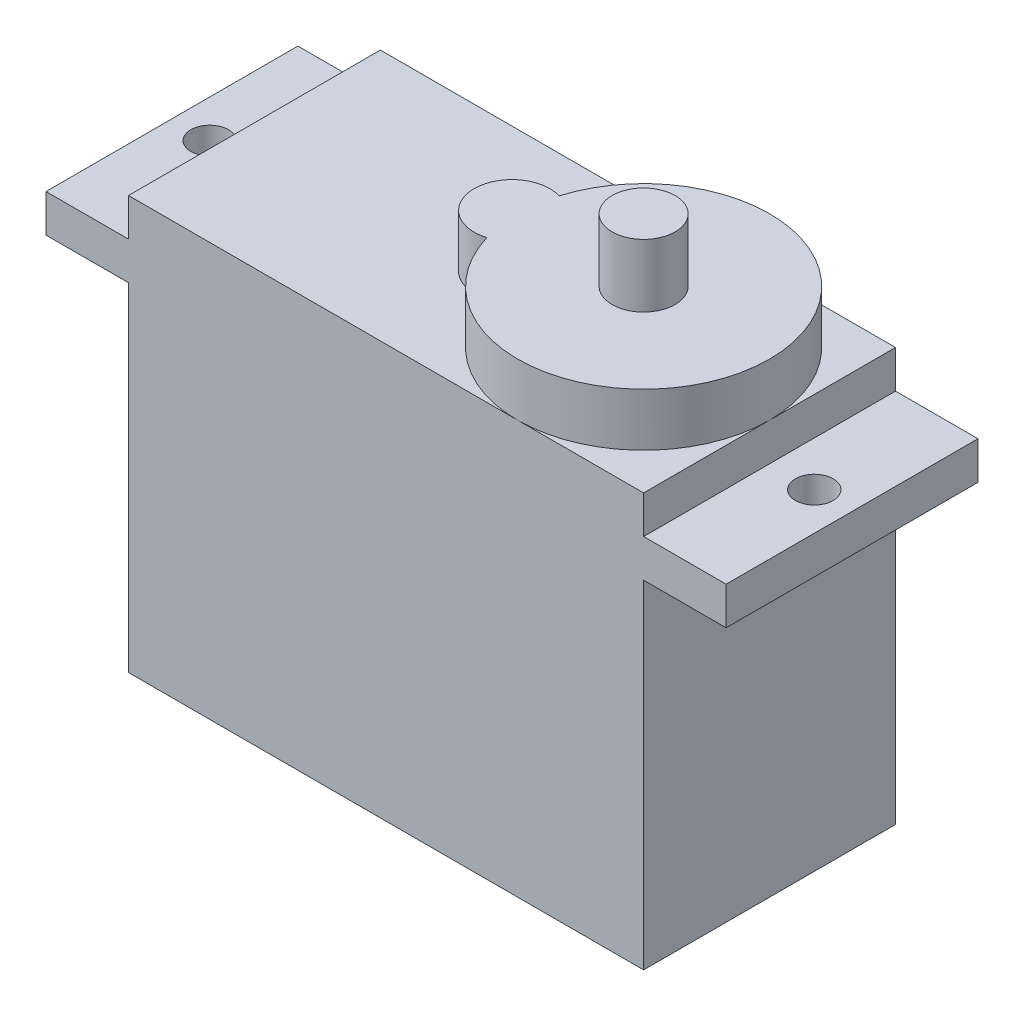
ISO-10303-21;
HEADER;
FILE_DESCRIPTION(('STEP AP214'),'2;1');
FILE_NAME('part.step','',(''),(''),'','','');
FILE_SCHEMA(('AUTOMOTIVE_DESIGN { 1 0 10303 214 1 1 1 1 }'));
ENDSEC;
DATA;
#1=APPLICATION_CONTEXT('core data for automotive mechanical design processes');
#2=APPLICATION_PROTOCOL_DEFINITION('international standard','automotive_design',2000,#1);
#3=PRODUCT_CONTEXT('',#1,'mechanical');
#4=PRODUCT('Part','Part','',(#3));
#5=PRODUCT_RELATED_PRODUCT_CATEGORY('part','',(#4));
#6=PRODUCT_DEFINITION_FORMATION('','',#4);
#7=PRODUCT_DEFINITION_CONTEXT('part definition',#1,'design');
#8=PRODUCT_DEFINITION('design','',#6,#7);
#9=PRODUCT_DEFINITION_SHAPE('','',#8);
#10=(LENGTH_UNIT() NAMED_UNIT(*) SI_UNIT(.MILLI.,.METRE.));
#11=(NAMED_UNIT(*) PLANE_ANGLE_UNIT() SI_UNIT($,.RADIAN.));
#12=(NAMED_UNIT(*) SI_UNIT($,.STERADIAN.) SOLID_ANGLE_UNIT());
#13=UNCERTAINTY_MEASURE_WITH_UNIT(LENGTH_MEASURE(1.E-05),#10,'distance_accuracy_value','');
#14=(GEOMETRIC_REPRESENTATION_CONTEXT(3) GLOBAL_UNCERTAINTY_ASSIGNED_CONTEXT((#13)) GLOBAL_UNIT_ASSIGNED_CONTEXT((#10,
#11,#12)) REPRESENTATION_CONTEXT('',''));
#15=CARTESIAN_POINT('',(0.,0.,0.));
#16=DIRECTION('',(0.,0.,1.));
#17=DIRECTION('',(1.,0.,0.));
#18=AXIS2_PLACEMENT_3D('',#15,#16,#17);
#19=CARTESIAN_POINT('',(0.,19.4,0.));
#20=DIRECTION('',(0.,1.,0.));
#21=DIRECTION('',(0.,0.,1.));
#22=AXIS2_PLACEMENT_3D('',#19,#20,#21);
#23=PLANE('',#22);
#24=CARTESIAN_POINT('',(0.,19.4,0.));
#25=DIRECTION('',(0.,1.,0.));
#26=DIRECTION('',(0.,0.,1.));
#27=AXIS2_PLACEMENT_3D('',#24,#25,#26);
#28=CIRCLE('',#27,3.);
#29=CARTESIAN_POINT('',(0.870933014354067,19.4,-2.87079704690319));
#30=VERTEX_POINT('',#29);
#31=CARTESIAN_POINT('',(0.870933014354069,19.4,2.87079704690319));
#32=VERTEX_POINT('',#31);
#33=EDGE_CURVE('E166',#30,#32,#28,.T.);
#34=ORIENTED_EDGE('',*,*,#33,.F.);
#35=CARTESIAN_POINT('',(10.45,19.4,0.));
#36=DIRECTION('',(0.,1.,0.));
#37=DIRECTION('',(0.,0.,1.));
#38=AXIS2_PLACEMENT_3D('',#35,#36,#37);
#39=CIRCLE('',#38,10.);
#40=CARTESIAN_POINT('',(10.45,19.4,-10.));
#41=VERTEX_POINT('',#40);
#42=EDGE_CURVE('E270',#41,#30,#39,.T.);
#43=ORIENTED_EDGE('',*,*,#42,.F.);
#44=DIRECTION('',(-1.,0.,0.));
#45=VECTOR('',#44,1.);
#46=CARTESIAN_POINT('',(-20.45,19.4,-10.));
#47=LINE('',#46,#45);
#48=CARTESIAN_POINT('',(-20.45,19.4,-10.));
#49=VERTEX_POINT('',#48);
#50=EDGE_CURVE('E176',#41,#49,#47,.T.);
#51=ORIENTED_EDGE('',*,*,#50,.T.);
#52=DIRECTION('',(0.,0.,1.));
#53=VECTOR('',#52,1.);
#54=CARTESIAN_POINT('',(-20.45,19.4,-10.));
#55=LINE('',#54,#53);
#56=CARTESIAN_POINT('',(-20.45,19.4,10.));
#57=VERTEX_POINT('',#56);
#58=EDGE_CURVE('E181',#49,#57,#55,.T.);
#59=ORIENTED_EDGE('',*,*,#58,.T.);
#60=DIRECTION('',(1.,0.,0.));
#61=VECTOR('',#60,1.);
#62=CARTESIAN_POINT('',(-20.45,19.4,10.));
#63=LINE('',#62,#61);
#64=CARTESIAN_POINT('',(10.45,19.4,10.));
#65=VERTEX_POINT('',#64);
#66=EDGE_CURVE('E184',#57,#65,#63,.T.);
#67=ORIENTED_EDGE('',*,*,#66,.T.);
#68=EDGE_CURVE('E49',#32,#65,#39,.T.);
#69=ORIENTED_EDGE('',*,*,#68,.F.);
#70=EDGE_LOOP('',(#34,#43,#51,#59,#67,#69));
#71=FACE_BOUND('',#70,.T.);
#72=ADVANCED_FACE('F38',(#71),#23,.T.);
#73=CARTESIAN_POINT('',(20.45,19.4,0.));
#74=VERTEX_POINT('',#73);
#75=EDGE_CURVE('E11',#65,#74,#39,.T.);
#76=ORIENTED_EDGE('',*,*,#75,.F.);
#77=CARTESIAN_POINT('',(20.45,19.4,10.));
#78=VERTEX_POINT('',#77);
#79=EDGE_CURVE('E183',#65,#78,#63,.T.);
#80=ORIENTED_EDGE('',*,*,#79,.T.);
#81=DIRECTION('',(0.,0.,-1.));
#82=VECTOR('',#81,1.);
#83=CARTESIAN_POINT('',(20.45,19.4,-10.));
#84=LINE('',#83,#82);
#85=EDGE_CURVE('E174',#78,#74,#84,.T.);
#86=ORIENTED_EDGE('',*,*,#85,.T.);
#87=EDGE_LOOP('',(#76,#80,#86));
#88=FACE_BOUND('',#87,.T.);
#89=ADVANCED_FACE('F297',(#88),#23,.T.);
#90=CARTESIAN_POINT('',(0.,16.4,0.));
#91=DIRECTION('',(0.,1.,0.));
#92=DIRECTION('',(-1.,0.,0.));
#93=AXIS2_PLACEMENT_3D('',#90,#91,#92);
#94=PLANE('',#93);
#95=DIRECTION('',(0.,0.,-1.));
#96=VECTOR('',#95,1.);
#97=CARTESIAN_POINT('',(20.45,16.4,-10.));
#98=LINE('',#97,#96);
#99=CARTESIAN_POINT('',(20.45,16.4,10.));
#100=VERTEX_POINT('',#99);
#101=CARTESIAN_POINT('',(20.45,16.4,-10.));
#102=VERTEX_POINT('',#101);
#103=EDGE_CURVE('E167',#100,#102,#98,.T.);
#104=ORIENTED_EDGE('',*,*,#103,.F.);
#105=DIRECTION('',(1.,0.,0.));
#106=VECTOR('',#105,1.);
#107=CARTESIAN_POINT('',(-27.,16.4,10.));
#108=LINE('',#107,#106);
#109=CARTESIAN_POINT('',(27.,16.4,10.));
#110=VERTEX_POINT('',#109);
#111=EDGE_CURVE('E222',#100,#110,#108,.T.);
#112=ORIENTED_EDGE('',*,*,#111,.T.);
#113=DIRECTION('',(0.,0.,-1.));
#114=VECTOR('',#113,1.);
#115=CARTESIAN_POINT('',(27.,16.4,-10.));
#116=LINE('',#115,#114);
#117=CARTESIAN_POINT('',(27.,16.4,-10.));
#118=VERTEX_POINT('',#117);
#119=EDGE_CURVE('E213',#110,#118,#116,.T.);
#120=ORIENTED_EDGE('',*,*,#119,.T.);
#121=DIRECTION('',(-1.,0.,0.));
#122=VECTOR('',#121,1.);
#123=CARTESIAN_POINT('',(-27.,16.4,-10.));
#124=LINE('',#123,#122);
#125=EDGE_CURVE('E218',#118,#102,#124,.T.);
#126=ORIENTED_EDGE('',*,*,#125,.T.);
#127=EDGE_LOOP('',(#104,#112,#120,#126));
#128=FACE_BOUND('',#127,.T.);
#129=CARTESIAN_POINT('',(24.,16.4,0.));
#130=DIRECTION('',(0.,1.,0.));
#131=DIRECTION('',(-1.,0.,0.));
#132=AXIS2_PLACEMENT_3D('',#129,#130,#131);
#133=CIRCLE('',#132,1.5);
#134=CARTESIAN_POINT('',(22.5,16.4,0.));
#135=VERTEX_POINT('',#134);
#136=EDGE_CURVE('E200',#135,#135,#133,.T.);
#137=ORIENTED_EDGE('',*,*,#136,.F.);
#138=EDGE_LOOP('',(#137));
#139=FACE_BOUND('',#138,.T.);
#140=ADVANCED_FACE('F303',(#128,#139),#94,.T.);
#141=CARTESIAN_POINT('',(20.45,13.4,10.));
#142=DIRECTION('',(-1.,0.,0.));
#143=DIRECTION('',(0.,-1.,0.));
#144=AXIS2_PLACEMENT_3D('',#141,#142,#143);
#145=PLANE('',#144);
#146=DIRECTION('',(0.,1.,0.));
#147=VECTOR('',#146,1.);
#148=CARTESIAN_POINT('',(20.45,13.4,-10.));
#149=LINE('',#148,#147);
#150=CARTESIAN_POINT('',(20.45,-13.4,-10.));
#151=VERTEX_POINT('',#150);
#152=CARTESIAN_POINT('',(20.45,13.4,-10.));
#153=VERTEX_POINT('',#152);
#154=EDGE_CURVE('E248',#151,#153,#149,.T.);
#155=ORIENTED_EDGE('',*,*,#154,.T.);
#156=DIRECTION('',(0.,0.,-1.));
#157=VECTOR('',#156,1.);
#158=CARTESIAN_POINT('',(20.45,13.4,10.));
#159=LINE('',#158,#157);
#160=CARTESIAN_POINT('',(20.45,13.4,10.));
#161=VERTEX_POINT('',#160);
#162=EDGE_CURVE('E42',#161,#153,#159,.T.);
#163=ORIENTED_EDGE('',*,*,#162,.F.);
#164=DIRECTION('',(0.,1.,0.));
#165=VECTOR('',#164,1.);
#166=CARTESIAN_POINT('',(20.45,13.4,10.));
#167=LINE('',#166,#165);
#168=CARTESIAN_POINT('',(20.45,-13.4,10.));
#169=VERTEX_POINT('',#168);
#170=EDGE_CURVE('E249',#169,#161,#167,.T.);
#171=ORIENTED_EDGE('',*,*,#170,.F.);
#172=DIRECTION('',(0.,0.,-1.));
#173=VECTOR('',#172,1.);
#174=CARTESIAN_POINT('',(20.45,-13.4,10.));
#175=LINE('',#174,#173);
#176=EDGE_CURVE('E256',#169,#151,#175,.T.);
#177=ORIENTED_EDGE('',*,*,#176,.T.);
#178=EDGE_LOOP('',(#155,#163,#171,#177));
#179=FACE_BOUND('',#178,.T.);
#180=ADVANCED_FACE('F40',(#179),#145,.F.);
#181=CARTESIAN_POINT('',(-20.45,13.4,10.));
#182=DIRECTION('',(1.,0.,0.));
#183=DIRECTION('',(0.,1.,0.));
#184=AXIS2_PLACEMENT_3D('',#181,#182,#183);
#185=PLANE('',#184);
#186=DIRECTION('',(0.,-1.,0.));
#187=VECTOR('',#186,1.);
#188=CARTESIAN_POINT('',(-20.45,13.4,-10.));
#189=LINE('',#188,#187);
#190=CARTESIAN_POINT('',(-20.45,13.4,-10.));
#191=VERTEX_POINT('',#190);
#192=CARTESIAN_POINT('',(-20.45,-13.4,-10.));
#193=VERTEX_POINT('',#192);
#194=EDGE_CURVE('E258',#191,#193,#189,.T.);
#195=ORIENTED_EDGE('',*,*,#194,.T.);
#196=DIRECTION('',(0.,0.,-1.));
#197=VECTOR('',#196,1.);
#198=CARTESIAN_POINT('',(-20.45,-13.4,10.));
#199=LINE('',#198,#197);
#200=CARTESIAN_POINT('',(-20.45,-13.4,10.));
#201=VERTEX_POINT('',#200);
#202=EDGE_CURVE('E263',#201,#193,#199,.T.);
#203=ORIENTED_EDGE('',*,*,#202,.F.);
#204=DIRECTION('',(0.,-1.,0.));
#205=VECTOR('',#204,1.);
#206=CARTESIAN_POINT('',(-20.45,13.4,10.));
#207=LINE('',#206,#205);
#208=CARTESIAN_POINT('',(-20.45,13.4,10.));
#209=VERTEX_POINT('',#208);
#210=EDGE_CURVE('E251',#209,#201,#207,.T.);
#211=ORIENTED_EDGE('',*,*,#210,.F.);
#212=DIRECTION('',(0.,0.,-1.));
#213=VECTOR('',#212,1.);
#214=CARTESIAN_POINT('',(-20.45,13.4,10.));
#215=LINE('',#214,#213);
#216=EDGE_CURVE('E265',#209,#191,#215,.T.);
#217=ORIENTED_EDGE('',*,*,#216,.T.);
#218=EDGE_LOOP('',(#195,#203,#211,#217));
#219=FACE_BOUND('',#218,.T.);
#220=ADVANCED_FACE('F355',(#219),#185,.F.);
#221=CARTESIAN_POINT('',(-20.45,-13.4,10.));
#222=DIRECTION('',(0.,1.,0.));
#223=DIRECTION('',(0.,0.,1.));
#224=AXIS2_PLACEMENT_3D('',#221,#222,#223);
#225=PLANE('',#224);
#226=DIRECTION('',(1.,0.,0.));
#227=VECTOR('',#226,1.);
#228=CARTESIAN_POINT('',(-20.45,-13.4,-10.));
#229=LINE('',#228,#227);
#230=EDGE_CURVE('E252',#193,#151,#229,.T.);
#231=ORIENTED_EDGE('',*,*,#230,.T.);
#232=ORIENTED_EDGE('',*,*,#176,.F.);
#233=DIRECTION('',(1.,0.,0.));
#234=VECTOR('',#233,1.);
#235=CARTESIAN_POINT('',(-20.45,-13.4,10.));
#236=LINE('',#235,#234);
#237=EDGE_CURVE('E254',#201,#169,#236,.T.);
#238=ORIENTED_EDGE('',*,*,#237,.F.);
#239=ORIENTED_EDGE('',*,*,#202,.T.);
#240=EDGE_LOOP('',(#231,#232,#238,#239));
#241=FACE_BOUND('',#240,.T.);
#242=ADVANCED_FACE('F358',(#241),#225,.F.);
#243=CARTESIAN_POINT('',(0.,0.,10.));
#244=DIRECTION('',(0.,0.,1.));
#245=DIRECTION('',(1.,0.,0.));
#246=AXIS2_PLACEMENT_3D('',#243,#244,#245);
#247=PLANE('',#246);
#248=ORIENTED_EDGE('',*,*,#170,.T.);
#249=DIRECTION('',(1.,0.,0.));
#250=VECTOR('',#249,1.);
#251=CARTESIAN_POINT('',(-27.,13.4,10.));
#252=LINE('',#251,#250);
#253=CARTESIAN_POINT('',(27.,13.4,10.));
#254=VERTEX_POINT('',#253);
#255=EDGE_CURVE('E234',#161,#254,#252,.T.);
#256=ORIENTED_EDGE('',*,*,#255,.T.);
#257=DIRECTION('',(0.,-1.,0.));
#258=VECTOR('',#257,1.);
#259=CARTESIAN_POINT('',(27.,16.4,10.));
#260=LINE('',#259,#258);
#261=EDGE_CURVE('E225',#110,#254,#260,.T.);
#262=ORIENTED_EDGE('',*,*,#261,.F.);
#263=ORIENTED_EDGE('',*,*,#111,.F.);
#264=DIRECTION('',(0.,-1.,0.));
#265=VECTOR('',#264,1.);
#266=CARTESIAN_POINT('',(20.45,19.4,10.));
#267=LINE('',#266,#265);
#268=EDGE_CURVE('E185',#78,#100,#267,.T.);
#269=ORIENTED_EDGE('',*,*,#268,.F.);
#270=ORIENTED_EDGE('',*,*,#79,.F.);
#271=ORIENTED_EDGE('',*,*,#66,.F.);
#272=DIRECTION('',(0.,-1.,0.));
#273=VECTOR('',#272,1.);
#274=CARTESIAN_POINT('',(-20.45,19.4,10.));
#275=LINE('',#274,#273);
#276=CARTESIAN_POINT('',(-20.45,16.4,10.));
#277=VERTEX_POINT('',#276);
#278=EDGE_CURVE('E191',#57,#277,#275,.T.);
#279=ORIENTED_EDGE('',*,*,#278,.T.);
#280=CARTESIAN_POINT('',(-27.,16.4,10.));
#281=VERTEX_POINT('',#280);
#282=EDGE_CURVE('E223',#281,#277,#108,.T.);
#283=ORIENTED_EDGE('',*,*,#282,.F.);
#284=DIRECTION('',(0.,-1.,0.));
#285=VECTOR('',#284,1.);
#286=CARTESIAN_POINT('',(-27.,16.4,10.));
#287=LINE('',#286,#285);
#288=CARTESIAN_POINT('',(-27.,13.4,10.));
#289=VERTEX_POINT('',#288);
#290=EDGE_CURVE('E239',#281,#289,#287,.T.);
#291=ORIENTED_EDGE('',*,*,#290,.T.);
#292=EDGE_CURVE('E217',#289,#209,#252,.T.);
#293=ORIENTED_EDGE('',*,*,#292,.T.);
#294=ORIENTED_EDGE('',*,*,#210,.T.);
#295=ORIENTED_EDGE('',*,*,#237,.T.);
#296=EDGE_LOOP('',(#248,#256,#262,#263,#269,#270,#271,#279,#283,#291,#293,#294,#295));
#297=FACE_BOUND('',#296,.T.);
#298=ADVANCED_FACE('F324',(#297),#247,.T.);
#299=CARTESIAN_POINT('',(0.,0.,-10.));
#300=DIRECTION('',(0.,0.,1.));
#301=DIRECTION('',(1.,0.,0.));
#302=AXIS2_PLACEMENT_3D('',#299,#300,#301);
#303=PLANE('',#302);
#304=ORIENTED_EDGE('',*,*,#154,.F.);
#305=ORIENTED_EDGE('',*,*,#230,.F.);
#306=ORIENTED_EDGE('',*,*,#194,.F.);
#307=DIRECTION('',(-1.,0.,0.));
#308=VECTOR('',#307,1.);
#309=CARTESIAN_POINT('',(-27.,13.4,-10.));
#310=LINE('',#309,#308);
#311=CARTESIAN_POINT('',(-27.,13.4,-10.));
#312=VERTEX_POINT('',#311);
#313=EDGE_CURVE('E228',#191,#312,#310,.T.);
#314=ORIENTED_EDGE('',*,*,#313,.T.);
#315=DIRECTION('',(0.,-1.,0.));
#316=VECTOR('',#315,1.);
#317=CARTESIAN_POINT('',(-27.,16.4,-10.));
#318=LINE('',#317,#316);
#319=CARTESIAN_POINT('',(-27.,16.4,-10.));
#320=VERTEX_POINT('',#319);
#321=EDGE_CURVE('E242',#320,#312,#318,.T.);
#322=ORIENTED_EDGE('',*,*,#321,.F.);
#323=CARTESIAN_POINT('',(-20.45,16.4,-10.));
#324=VERTEX_POINT('',#323);
#325=EDGE_CURVE('E216',#324,#320,#124,.T.);
#326=ORIENTED_EDGE('',*,*,#325,.F.);
#327=DIRECTION('',(0.,-1.,0.));
#328=VECTOR('',#327,1.);
#329=CARTESIAN_POINT('',(-20.45,19.4,-10.));
#330=LINE('',#329,#328);
#331=EDGE_CURVE('E194',#49,#324,#330,.T.);
#332=ORIENTED_EDGE('',*,*,#331,.F.);
#333=ORIENTED_EDGE('',*,*,#50,.F.);
#334=CARTESIAN_POINT('',(20.45,19.4,-10.));
#335=VERTEX_POINT('',#334);
#336=EDGE_CURVE('E178',#335,#41,#47,.T.);
#337=ORIENTED_EDGE('',*,*,#336,.F.);
#338=DIRECTION('',(0.,-1.,0.));
#339=VECTOR('',#338,1.);
#340=CARTESIAN_POINT('',(20.45,19.4,-10.));
#341=LINE('',#340,#339);
#342=EDGE_CURVE('E197',#335,#102,#341,.T.);
#343=ORIENTED_EDGE('',*,*,#342,.T.);
#344=ORIENTED_EDGE('',*,*,#125,.F.);
#345=DIRECTION('',(0.,-1.,0.));
#346=VECTOR('',#345,1.);
#347=CARTESIAN_POINT('',(27.,16.4,-10.));
#348=LINE('',#347,#346);
#349=CARTESIAN_POINT('',(27.,13.4,-10.));
#350=VERTEX_POINT('',#349);
#351=EDGE_CURVE('E245',#118,#350,#348,.T.);
#352=ORIENTED_EDGE('',*,*,#351,.T.);
#353=EDGE_CURVE('E229',#350,#153,#310,.T.);
#354=ORIENTED_EDGE('',*,*,#353,.T.);
#355=EDGE_LOOP('',(#304,#305,#306,#314,#322,#326,#332,#333,#337,#343,#344,#352,#354));
#356=FACE_BOUND('',#355,.T.);
#357=ADVANCED_FACE('F332',(#356),#303,.F.);
#358=CARTESIAN_POINT('',(0.,13.4,0.));
#359=DIRECTION('',(0.,1.,0.));
#360=DIRECTION('',(-1.,0.,0.));
#361=AXIS2_PLACEMENT_3D('',#358,#359,#360);
#362=PLANE('',#361);
#363=CARTESIAN_POINT('',(24.,13.4,0.));
#364=DIRECTION('',(0.,1.,0.));
#365=DIRECTION('',(-1.,0.,0.));
#366=AXIS2_PLACEMENT_3D('',#363,#364,#365);
#367=CIRCLE('',#366,1.5);
#368=CARTESIAN_POINT('',(22.5,13.4,0.));
#369=VERTEX_POINT('',#368);
#370=EDGE_CURVE('E208',#369,#369,#367,.T.);
#371=ORIENTED_EDGE('',*,*,#370,.T.);
#372=EDGE_LOOP('',(#371));
#373=FACE_BOUND('',#372,.T.);
#374=ORIENTED_EDGE('',*,*,#255,.F.);
#375=ORIENTED_EDGE('',*,*,#162,.T.);
#376=ORIENTED_EDGE('',*,*,#353,.F.);
#377=DIRECTION('',(0.,0.,-1.));
#378=VECTOR('',#377,1.);
#379=CARTESIAN_POINT('',(27.,13.4,-10.));
#380=LINE('',#379,#378);
#381=EDGE_CURVE('E204',#254,#350,#380,.T.);
#382=ORIENTED_EDGE('',*,*,#381,.F.);
#383=EDGE_LOOP('',(#374,#375,#376,#382));
#384=FACE_BOUND('',#383,.T.);
#385=ADVANCED_FACE('F364',(#373,#384),#362,.F.);
#386=CARTESIAN_POINT('',(27.,16.4,-10.));
#387=DIRECTION('',(-1.,0.,0.));
#388=DIRECTION('',(0.,-1.,0.));
#389=AXIS2_PLACEMENT_3D('',#386,#387,#388);
#390=PLANE('',#389);
#391=ORIENTED_EDGE('',*,*,#381,.T.);
#392=ORIENTED_EDGE('',*,*,#351,.F.);
#393=ORIENTED_EDGE('',*,*,#119,.F.);
#394=ORIENTED_EDGE('',*,*,#261,.T.);
#395=EDGE_LOOP('',(#391,#392,#393,#394));
#396=FACE_BOUND('',#395,.T.);
#397=ADVANCED_FACE('F363',(#396),#390,.F.);
#398=CARTESIAN_POINT('',(-27.,16.4,-10.));
#399=DIRECTION('',(1.,0.,0.));
#400=DIRECTION('',(0.,1.,0.));
#401=AXIS2_PLACEMENT_3D('',#398,#399,#400);
#402=PLANE('',#401);
#403=DIRECTION('',(0.,0.,1.));
#404=VECTOR('',#403,1.);
#405=CARTESIAN_POINT('',(-27.,13.4,-10.));
#406=LINE('',#405,#404);
#407=EDGE_CURVE('E232',#312,#289,#406,.T.);
#408=ORIENTED_EDGE('',*,*,#407,.T.);
#409=ORIENTED_EDGE('',*,*,#290,.F.);
#410=DIRECTION('',(0.,0.,1.));
#411=VECTOR('',#410,1.);
#412=CARTESIAN_POINT('',(-27.,16.4,-10.));
#413=LINE('',#412,#411);
#414=EDGE_CURVE('E220',#320,#281,#413,.T.);
#415=ORIENTED_EDGE('',*,*,#414,.F.);
#416=ORIENTED_EDGE('',*,*,#321,.T.);
#417=EDGE_LOOP('',(#408,#409,#415,#416));
#418=FACE_BOUND('',#417,.T.);
#419=ADVANCED_FACE('F347',(#418),#402,.F.);
#420=DIRECTION('',(0.,0.,1.));
#421=VECTOR('',#420,1.);
#422=CARTESIAN_POINT('',(-20.45,16.4,-10.));
#423=LINE('',#422,#421);
#424=EDGE_CURVE('E170',#324,#277,#423,.T.);
#425=ORIENTED_EDGE('',*,*,#424,.F.);
#426=ORIENTED_EDGE('',*,*,#325,.T.);
#427=ORIENTED_EDGE('',*,*,#414,.T.);
#428=ORIENTED_EDGE('',*,*,#282,.T.);
#429=EDGE_LOOP('',(#425,#426,#427,#428));
#430=FACE_BOUND('',#429,.T.);
#431=CARTESIAN_POINT('',(-24.,16.4,0.));
#432=DIRECTION('',(0.,1.,0.));
#433=DIRECTION('',(-1.,0.,0.));
#434=AXIS2_PLACEMENT_3D('',#431,#432,#433);
#435=CIRCLE('',#434,1.5);
#436=CARTESIAN_POINT('',(-25.5,16.4,0.));
#437=VERTEX_POINT('',#436);
#438=EDGE_CURVE('E205',#437,#437,#435,.T.);
#439=ORIENTED_EDGE('',*,*,#438,.F.);
#440=EDGE_LOOP('',(#439));
#441=FACE_BOUND('',#440,.T.);
#442=ADVANCED_FACE('F342',(#430,#441),#94,.T.);
#443=CARTESIAN_POINT('',(-24.,13.4,0.));
#444=DIRECTION('',(0.,1.,0.));
#445=DIRECTION('',(-1.,0.,0.));
#446=AXIS2_PLACEMENT_3D('',#443,#444,#445);
#447=CIRCLE('',#446,1.5);
#448=CARTESIAN_POINT('',(-25.5,13.4,0.));
#449=VERTEX_POINT('',#448);
#450=EDGE_CURVE('E201',#449,#449,#447,.T.);
#451=ORIENTED_EDGE('',*,*,#450,.T.);
#452=EDGE_LOOP('',(#451));
#453=FACE_BOUND('',#452,.T.);
#454=ORIENTED_EDGE('',*,*,#216,.F.);
#455=ORIENTED_EDGE('',*,*,#292,.F.);
#456=ORIENTED_EDGE('',*,*,#407,.F.);
#457=ORIENTED_EDGE('',*,*,#313,.F.);
#458=EDGE_LOOP('',(#454,#455,#456,#457));
#459=FACE_BOUND('',#458,.T.);
#460=ADVANCED_FACE('F351',(#453,#459),#362,.F.);
#461=CARTESIAN_POINT('',(-24.,13.4,0.));
#462=DIRECTION('',(0.,1.,0.));
#463=DIRECTION('',(-1.,0.,0.));
#464=AXIS2_PLACEMENT_3D('',#461,#462,#463);
#465=CYLINDRICAL_SURFACE('',#464,1.5);
#466=ORIENTED_EDGE('',*,*,#450,.F.);
#467=EDGE_LOOP('',(#466));
#468=FACE_BOUND('',#467,.T.);
#469=ORIENTED_EDGE('',*,*,#438,.T.);
#470=EDGE_LOOP('',(#469));
#471=FACE_BOUND('',#470,.T.);
#472=ADVANCED_FACE('F377',(#468,#471),#465,.F.);
#473=CARTESIAN_POINT('',(24.,13.4,0.));
#474=DIRECTION('',(0.,1.,0.));
#475=DIRECTION('',(-1.,0.,0.));
#476=AXIS2_PLACEMENT_3D('',#473,#474,#475);
#477=CYLINDRICAL_SURFACE('',#476,1.5);
#478=ORIENTED_EDGE('',*,*,#370,.F.);
#479=EDGE_LOOP('',(#478));
#480=FACE_BOUND('',#479,.T.);
#481=ORIENTED_EDGE('',*,*,#136,.T.);
#482=EDGE_LOOP('',(#481));
#483=FACE_BOUND('',#482,.T.);
#484=ADVANCED_FACE('F383',(#480,#483),#477,.F.);
#485=CARTESIAN_POINT('',(20.45,19.4,-10.));
#486=DIRECTION('',(-1.,0.,0.));
#487=DIRECTION('',(0.,-1.,0.));
#488=AXIS2_PLACEMENT_3D('',#485,#486,#487);
#489=PLANE('',#488);
#490=ORIENTED_EDGE('',*,*,#103,.T.);
#491=ORIENTED_EDGE('',*,*,#342,.F.);
#492=EDGE_CURVE('E177',#74,#335,#84,.T.);
#493=ORIENTED_EDGE('',*,*,#492,.F.);
#494=ORIENTED_EDGE('',*,*,#85,.F.);
#495=ORIENTED_EDGE('',*,*,#268,.T.);
#496=EDGE_LOOP('',(#490,#491,#493,#494,#495));
#497=FACE_BOUND('',#496,.T.);
#498=ADVANCED_FACE('F313',(#497),#489,.F.);
#499=CARTESIAN_POINT('',(-20.45,19.4,-10.));
#500=DIRECTION('',(1.,0.,0.));
#501=DIRECTION('',(0.,1.,0.));
#502=AXIS2_PLACEMENT_3D('',#499,#500,#501);
#503=PLANE('',#502);
#504=ORIENTED_EDGE('',*,*,#424,.T.);
#505=ORIENTED_EDGE('',*,*,#278,.F.);
#506=ORIENTED_EDGE('',*,*,#58,.F.);
#507=ORIENTED_EDGE('',*,*,#331,.T.);
#508=EDGE_LOOP('',(#504,#505,#506,#507));
#509=FACE_BOUND('',#508,.T.);
#510=ADVANCED_FACE('F307',(#509),#503,.F.);
#511=EDGE_CURVE('E47',#74,#41,#39,.T.);
#512=ORIENTED_EDGE('',*,*,#511,.F.);
#513=ORIENTED_EDGE('',*,*,#492,.T.);
#514=ORIENTED_EDGE('',*,*,#336,.T.);
#515=EDGE_LOOP('',(#512,#513,#514));
#516=FACE_BOUND('',#515,.T.);
#517=ADVANCED_FACE('F299',(#516),#23,.T.);
#518=CARTESIAN_POINT('',(0.,23.6,0.));
#519=DIRECTION('',(0.,-1.,0.));
#520=DIRECTION('',(0.,0.,-1.));
#521=AXIS2_PLACEMENT_3D('',#518,#519,#520);
#522=CYLINDRICAL_SURFACE('',#521,3.);
#523=ORIENTED_EDGE('',*,*,#33,.T.);
#524=DIRECTION('',(0.,-1.,0.));
#525=VECTOR('',#524,1.);
#526=CARTESIAN_POINT('',(0.870933014354069,23.6,2.87079704690319));
#527=LINE('',#526,#525);
#528=CARTESIAN_POINT('',(0.870933014354069,23.6,2.87079704690319));
#529=VERTEX_POINT('',#528);
#530=EDGE_CURVE('E153',#529,#32,#527,.T.);
#531=ORIENTED_EDGE('',*,*,#530,.F.);
#532=CARTESIAN_POINT('',(0.,23.6,0.));
#533=DIRECTION('',(0.,1.,0.));
#534=DIRECTION('',(0.,0.,1.));
#535=AXIS2_PLACEMENT_3D('',#532,#533,#534);
#536=CIRCLE('',#535,3.);
#537=CARTESIAN_POINT('',(0.870933014354067,23.6,-2.87079704690319));
#538=VERTEX_POINT('',#537);
#539=EDGE_CURVE('E160',#538,#529,#536,.T.);
#540=ORIENTED_EDGE('',*,*,#539,.F.);
#541=DIRECTION('',(0.,-1.,0.));
#542=VECTOR('',#541,1.);
#543=CARTESIAN_POINT('',(0.870933014354067,23.6,-2.87079704690319));
#544=LINE('',#543,#542);
#545=EDGE_CURVE('E157',#538,#30,#544,.T.);
#546=ORIENTED_EDGE('',*,*,#545,.T.);
#547=EDGE_LOOP('',(#523,#531,#540,#546));
#548=FACE_BOUND('',#547,.T.);
#549=ADVANCED_FACE('F165',(#548),#522,.T.);
#550=CARTESIAN_POINT('',(10.45,23.6,0.));
#551=DIRECTION('',(0.,-1.,0.));
#552=DIRECTION('',(0.,0.,-1.));
#553=AXIS2_PLACEMENT_3D('',#550,#551,#552);
#554=CYLINDRICAL_SURFACE('',#553,10.);
#555=ORIENTED_EDGE('',*,*,#68,.T.);
#556=ORIENTED_EDGE('',*,*,#75,.T.);
#557=ORIENTED_EDGE('',*,*,#511,.T.);
#558=ORIENTED_EDGE('',*,*,#42,.T.);
#559=ORIENTED_EDGE('',*,*,#545,.F.);
#560=CARTESIAN_POINT('',(10.45,23.6,0.));
#561=DIRECTION('',(0.,1.,0.));
#562=DIRECTION('',(0.,0.,1.));
#563=AXIS2_PLACEMENT_3D('',#560,#561,#562);
#564=CIRCLE('',#563,10.);
#565=EDGE_CURVE('E149',#529,#538,#564,.T.);
#566=ORIENTED_EDGE('',*,*,#565,.F.);
#567=ORIENTED_EDGE('',*,*,#530,.T.);
#568=EDGE_LOOP('',(#555,#556,#557,#558,#559,#566,#567));
#569=FACE_BOUND('',#568,.T.);
#570=ADVANCED_FACE('F151',(#569),#554,.T.);
#571=CARTESIAN_POINT('',(5.225,23.6,0.));
#572=DIRECTION('',(0.,1.,0.));
#573=DIRECTION('',(0.,0.,1.));
#574=AXIS2_PLACEMENT_3D('',#571,#572,#573);
#575=PLANE('',#574);
#576=CARTESIAN_POINT('',(10.45,23.6,0.));
#577=DIRECTION('',(0.,1.,0.));
#578=DIRECTION('',(0.,0.,1.));
#579=AXIS2_PLACEMENT_3D('',#576,#577,#578);
#580=CIRCLE('',#579,2.5);
#581=CARTESIAN_POINT('',(10.45,23.6,2.5));
#582=VERTEX_POINT('',#581);
#583=EDGE_CURVE('E278',#582,#582,#580,.T.);
#584=ORIENTED_EDGE('',*,*,#583,.F.);
#585=EDGE_LOOP('',(#584));
#586=FACE_BOUND('',#585,.T.);
#587=ORIENTED_EDGE('',*,*,#539,.T.);
#588=ORIENTED_EDGE('',*,*,#565,.T.);
#589=EDGE_LOOP('',(#587,#588));
#590=FACE_BOUND('',#589,.T.);
#591=ADVANCED_FACE('F162',(#586,#590),#575,.T.);
#592=CARTESIAN_POINT('',(10.45,28.6,0.));
#593=DIRECTION('',(0.,-1.,0.));
#594=DIRECTION('',(0.,0.,-1.));
#595=AXIS2_PLACEMENT_3D('',#592,#593,#594);
#596=CYLINDRICAL_SURFACE('',#595,2.5);
#597=CARTESIAN_POINT('',(10.45,28.6,0.));
#598=DIRECTION('',(0.,1.,0.));
#599=DIRECTION('',(0.,0.,1.));
#600=AXIS2_PLACEMENT_3D('',#597,#598,#599);
#601=CIRCLE('',#600,2.5);
#602=CARTESIAN_POINT('',(10.45,28.6,2.5));
#603=VERTEX_POINT('',#602);
#604=EDGE_CURVE('E276',#603,#603,#601,.T.);
#605=ORIENTED_EDGE('',*,*,#604,.F.);
#606=EDGE_LOOP('',(#605));
#607=FACE_BOUND('',#606,.T.);
#608=ORIENTED_EDGE('',*,*,#583,.T.);
#609=EDGE_LOOP('',(#608));
#610=FACE_BOUND('',#609,.T.);
#611=ADVANCED_FACE('F284',(#607,#610),#596,.T.);
#612=CARTESIAN_POINT('',(10.45,28.6,0.));
#613=DIRECTION('',(0.,1.,0.));
#614=DIRECTION('',(0.,0.,1.));
#615=AXIS2_PLACEMENT_3D('',#612,#613,#614);
#616=PLANE('',#615);
#617=ORIENTED_EDGE('',*,*,#604,.T.);
#618=EDGE_LOOP('',(#617));
#619=FACE_BOUND('',#618,.T.);
#620=ADVANCED_FACE('F292',(#619),#616,.T.);
#621=CLOSED_SHELL('',(#72,#89,#140,#180,#220,#242,#298,#357,#385,#397,#419,#442,#460,#472,#484,
#498,#510,#517,#549,#570,#591,#611,#620));
#622=MANIFOLD_SOLID_BREP('B2',#621);
#623=ADVANCED_BREP_SHAPE_REPRESENTATION('',(#18,#622),#14);
#624=SHAPE_DEFINITION_REPRESENTATION(#9,#623);
ENDSEC;
END-ISO-10303-21;
